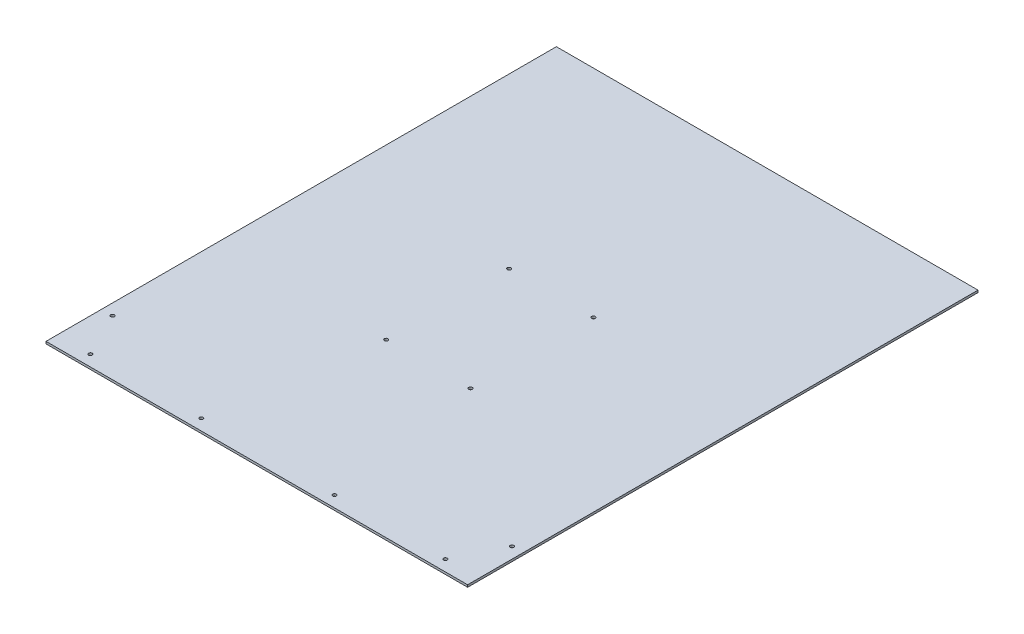
ISO-10303-21;
HEADER;
FILE_DESCRIPTION(('STEP AP214'),'2;1');
FILE_NAME('part.step','',(''),(''),'','','');
FILE_SCHEMA(('AUTOMOTIVE_DESIGN { 1 0 10303 214 1 1 1 1 }'));
ENDSEC;
DATA;
#1=APPLICATION_CONTEXT('core data for automotive mechanical design processes');
#2=APPLICATION_PROTOCOL_DEFINITION('international standard','automotive_design',2000,#1);
#3=PRODUCT_CONTEXT('',#1,'mechanical');
#4=PRODUCT('Part','Part','',(#3));
#5=PRODUCT_RELATED_PRODUCT_CATEGORY('part','',(#4));
#6=PRODUCT_DEFINITION_FORMATION('','',#4);
#7=PRODUCT_DEFINITION_CONTEXT('part definition',#1,'design');
#8=PRODUCT_DEFINITION('design','',#6,#7);
#9=PRODUCT_DEFINITION_SHAPE('','',#8);
#10=(LENGTH_UNIT() NAMED_UNIT(*) SI_UNIT(.MILLI.,.METRE.));
#11=(NAMED_UNIT(*) PLANE_ANGLE_UNIT() SI_UNIT($,.RADIAN.));
#12=(NAMED_UNIT(*) SI_UNIT($,.STERADIAN.) SOLID_ANGLE_UNIT());
#13=UNCERTAINTY_MEASURE_WITH_UNIT(LENGTH_MEASURE(1.E-05),#10,'distance_accuracy_value','');
#14=(GEOMETRIC_REPRESENTATION_CONTEXT(3) GLOBAL_UNCERTAINTY_ASSIGNED_CONTEXT((#13)) GLOBAL_UNIT_ASSIGNED_CONTEXT((#10,
#11,#12)) REPRESENTATION_CONTEXT('',''));
#15=CARTESIAN_POINT('',(0.,0.,0.));
#16=DIRECTION('',(0.,0.,1.));
#17=DIRECTION('',(1.,0.,0.));
#18=AXIS2_PLACEMENT_3D('',#15,#16,#17);
#19=CARTESIAN_POINT('',(475.,5.,0.));
#20=DIRECTION('',(1.,0.,0.));
#21=DIRECTION('',(0.,0.,-1.));
#22=AXIS2_PLACEMENT_3D('',#19,#20,#21);
#23=PLANE('',#22);
#24=DIRECTION('',(0.,0.,1.));
#25=VECTOR('',#24,1.);
#26=CARTESIAN_POINT('',(475.,0.,0.));
#27=LINE('',#26,#25);
#28=CARTESIAN_POINT('',(475.,0.,-575.));
#29=VERTEX_POINT('',#28);
#30=CARTESIAN_POINT('',(475.,0.,575.));
#31=VERTEX_POINT('',#30);
#32=EDGE_CURVE('E111',#29,#31,#27,.T.);
#33=ORIENTED_EDGE('',*,*,#32,.F.);
#34=DIRECTION('',(0.,-1.,0.));
#35=VECTOR('',#34,1.);
#36=CARTESIAN_POINT('',(475.,5.,-575.));
#37=LINE('',#36,#35);
#38=CARTESIAN_POINT('',(475.,5.,-575.));
#39=VERTEX_POINT('',#38);
#40=EDGE_CURVE('E11',#39,#29,#37,.T.);
#41=ORIENTED_EDGE('',*,*,#40,.F.);
#42=DIRECTION('',(0.,0.,1.));
#43=VECTOR('',#42,1.);
#44=CARTESIAN_POINT('',(475.,5.,0.));
#45=LINE('',#44,#43);
#46=CARTESIAN_POINT('',(475.,5.,575.));
#47=VERTEX_POINT('',#46);
#48=EDGE_CURVE('E101',#39,#47,#45,.T.);
#49=ORIENTED_EDGE('',*,*,#48,.T.);
#50=DIRECTION('',(0.,-1.,0.));
#51=VECTOR('',#50,1.);
#52=CARTESIAN_POINT('',(475.,5.,575.));
#53=LINE('',#52,#51);
#54=EDGE_CURVE('E80',#47,#31,#53,.T.);
#55=ORIENTED_EDGE('',*,*,#54,.T.);
#56=EDGE_LOOP('',(#33,#41,#49,#55));
#57=FACE_BOUND('',#56,.T.);
#58=ADVANCED_FACE('F41',(#57),#23,.T.);
#59=CARTESIAN_POINT('',(0.,5.,-575.));
#60=DIRECTION('',(0.,0.,-1.));
#61=DIRECTION('',(-1.,0.,0.));
#62=AXIS2_PLACEMENT_3D('',#59,#60,#61);
#63=PLANE('',#62);
#64=DIRECTION('',(1.,0.,0.));
#65=VECTOR('',#64,1.);
#66=CARTESIAN_POINT('',(0.,0.,-575.));
#67=LINE('',#66,#65);
#68=CARTESIAN_POINT('',(-475.,0.,-575.));
#69=VERTEX_POINT('',#68);
#70=EDGE_CURVE('E93',#69,#29,#67,.T.);
#71=ORIENTED_EDGE('',*,*,#70,.F.);
#72=DIRECTION('',(0.,-1.,0.));
#73=VECTOR('',#72,1.);
#74=CARTESIAN_POINT('',(-475.,5.,-575.));
#75=LINE('',#74,#73);
#76=CARTESIAN_POINT('',(-475.,5.,-575.));
#77=VERTEX_POINT('',#76);
#78=EDGE_CURVE('E50',#77,#69,#75,.T.);
#79=ORIENTED_EDGE('',*,*,#78,.F.);
#80=DIRECTION('',(1.,0.,0.));
#81=VECTOR('',#80,1.);
#82=CARTESIAN_POINT('',(0.,5.,-575.));
#83=LINE('',#82,#81);
#84=EDGE_CURVE('E91',#77,#39,#83,.T.);
#85=ORIENTED_EDGE('',*,*,#84,.T.);
#86=ORIENTED_EDGE('',*,*,#40,.T.);
#87=EDGE_LOOP('',(#71,#79,#85,#86));
#88=FACE_BOUND('',#87,.T.);
#89=ADVANCED_FACE('F89',(#88),#63,.T.);
#90=CARTESIAN_POINT('',(-475.,5.,0.));
#91=DIRECTION('',(1.,0.,0.));
#92=DIRECTION('',(0.,0.,-1.));
#93=AXIS2_PLACEMENT_3D('',#90,#91,#92);
#94=PLANE('',#93);
#95=DIRECTION('',(0.,0.,1.));
#96=VECTOR('',#95,1.);
#97=CARTESIAN_POINT('',(-475.,0.,0.));
#98=LINE('',#97,#96);
#99=CARTESIAN_POINT('',(-475.,0.,575.));
#100=VERTEX_POINT('',#99);
#101=EDGE_CURVE('E73',#69,#100,#98,.T.);
#102=ORIENTED_EDGE('',*,*,#101,.T.);
#103=DIRECTION('',(0.,-1.,0.));
#104=VECTOR('',#103,1.);
#105=CARTESIAN_POINT('',(-475.,5.,575.));
#106=LINE('',#105,#104);
#107=CARTESIAN_POINT('',(-475.,5.,575.));
#108=VERTEX_POINT('',#107);
#109=EDGE_CURVE('E95',#108,#100,#106,.T.);
#110=ORIENTED_EDGE('',*,*,#109,.F.);
#111=DIRECTION('',(0.,0.,1.));
#112=VECTOR('',#111,1.);
#113=CARTESIAN_POINT('',(-475.,5.,0.));
#114=LINE('',#113,#112);
#115=EDGE_CURVE('E96',#77,#108,#114,.T.);
#116=ORIENTED_EDGE('',*,*,#115,.F.);
#117=ORIENTED_EDGE('',*,*,#78,.T.);
#118=EDGE_LOOP('',(#102,#110,#116,#117));
#119=FACE_BOUND('',#118,.T.);
#120=ADVANCED_FACE('F97',(#119),#94,.F.);
#121=CARTESIAN_POINT('',(0.,5.,575.));
#122=DIRECTION('',(0.,0.,-1.));
#123=DIRECTION('',(-1.,0.,0.));
#124=AXIS2_PLACEMENT_3D('',#121,#122,#123);
#125=PLANE('',#124);
#126=DIRECTION('',(1.,0.,0.));
#127=VECTOR('',#126,1.);
#128=CARTESIAN_POINT('',(0.,0.,575.));
#129=LINE('',#128,#127);
#130=EDGE_CURVE('E105',#100,#31,#129,.T.);
#131=ORIENTED_EDGE('',*,*,#130,.T.);
#132=ORIENTED_EDGE('',*,*,#54,.F.);
#133=DIRECTION('',(1.,0.,0.));
#134=VECTOR('',#133,1.);
#135=CARTESIAN_POINT('',(0.,5.,575.));
#136=LINE('',#135,#134);
#137=EDGE_CURVE('E58',#108,#47,#136,.T.);
#138=ORIENTED_EDGE('',*,*,#137,.F.);
#139=ORIENTED_EDGE('',*,*,#109,.T.);
#140=EDGE_LOOP('',(#131,#132,#138,#139));
#141=FACE_BOUND('',#140,.T.);
#142=ADVANCED_FACE('F127',(#141),#125,.F.);
#143=CARTESIAN_POINT('',(0.,5.,0.));
#144=DIRECTION('',(0.,1.,0.));
#145=DIRECTION('',(0.,0.,1.));
#146=AXIS2_PLACEMENT_3D('',#143,#144,#145);
#147=PLANE('',#146);
#148=CARTESIAN_POINT('',(-450.,5.,450.));
#149=DIRECTION('',(0.,1.,0.));
#150=DIRECTION('',(0.,0.,1.));
#151=AXIS2_PLACEMENT_3D('',#148,#149,#150);
#152=CIRCLE('',#151,3.99999999999999);
#153=CARTESIAN_POINT('',(-450.,5.,454.));
#154=VERTEX_POINT('',#153);
#155=EDGE_CURVE('E191',#154,#154,#152,.T.);
#156=ORIENTED_EDGE('',*,*,#155,.F.);
#157=EDGE_LOOP('',(#156));
#158=FACE_BOUND('',#157,.T.);
#159=CARTESIAN_POINT('',(400.,5.,550.));
#160=DIRECTION('',(0.,1.,0.));
#161=DIRECTION('',(0.,0.,1.));
#162=AXIS2_PLACEMENT_3D('',#159,#160,#161);
#163=CIRCLE('',#162,3.99999999999994);
#164=CARTESIAN_POINT('',(400.,5.,554.));
#165=VERTEX_POINT('',#164);
#166=EDGE_CURVE('E234',#165,#165,#163,.T.);
#167=ORIENTED_EDGE('',*,*,#166,.F.);
#168=EDGE_LOOP('',(#167));
#169=FACE_BOUND('',#168,.T.);
#170=CARTESIAN_POINT('',(150.,5.,550.));
#171=DIRECTION('',(0.,1.,0.));
#172=DIRECTION('',(0.,0.,1.));
#173=AXIS2_PLACEMENT_3D('',#170,#171,#172);
#174=CIRCLE('',#173,3.99999999999999);
#175=CARTESIAN_POINT('',(150.,5.,554.));
#176=VERTEX_POINT('',#175);
#177=EDGE_CURVE('E230',#176,#176,#174,.T.);
#178=ORIENTED_EDGE('',*,*,#177,.F.);
#179=EDGE_LOOP('',(#178));
#180=FACE_BOUND('',#179,.T.);
#181=CARTESIAN_POINT('',(450.,5.,450.));
#182=DIRECTION('',(0.,1.,0.));
#183=DIRECTION('',(0.,0.,1.));
#184=AXIS2_PLACEMENT_3D('',#181,#182,#183);
#185=CIRCLE('',#184,3.99999999999999);
#186=CARTESIAN_POINT('',(450.,5.,454.));
#187=VERTEX_POINT('',#186);
#188=EDGE_CURVE('E226',#187,#187,#185,.T.);
#189=ORIENTED_EDGE('',*,*,#188,.F.);
#190=EDGE_LOOP('',(#189));
#191=FACE_BOUND('',#190,.T.);
#192=CARTESIAN_POINT('',(-150.,5.,550.));
#193=DIRECTION('',(0.,1.,0.));
#194=DIRECTION('',(0.,0.,1.));
#195=AXIS2_PLACEMENT_3D('',#192,#193,#194);
#196=CIRCLE('',#195,3.99999999999999);
#197=CARTESIAN_POINT('',(-150.,5.,554.));
#198=VERTEX_POINT('',#197);
#199=EDGE_CURVE('E202',#198,#198,#196,.T.);
#200=ORIENTED_EDGE('',*,*,#199,.F.);
#201=EDGE_LOOP('',(#200));
#202=FACE_BOUND('',#201,.T.);
#203=CARTESIAN_POINT('',(-400.,5.,550.));
#204=DIRECTION('',(0.,1.,0.));
#205=DIRECTION('',(0.,0.,1.));
#206=AXIS2_PLACEMENT_3D('',#203,#204,#205);
#207=CIRCLE('',#206,3.99999999999999);
#208=CARTESIAN_POINT('',(-400.,5.,554.));
#209=VERTEX_POINT('',#208);
#210=EDGE_CURVE('E196',#209,#209,#207,.T.);
#211=ORIENTED_EDGE('',*,*,#210,.F.);
#212=EDGE_LOOP('',(#211));
#213=FACE_BOUND('',#212,.T.);
#214=CARTESIAN_POINT('',(-94.9999999999999,5.,-88.5000000000001));
#215=DIRECTION('',(0.,1.,0.));
#216=DIRECTION('',(0.,0.,-1.));
#217=AXIS2_PLACEMENT_3D('',#214,#215,#216);
#218=CIRCLE('',#217,3.99999999999999);
#219=CARTESIAN_POINT('',(-94.9999999999999,5.,-92.5));
#220=VERTEX_POINT('',#219);
#221=EDGE_CURVE('E254',#220,#220,#218,.T.);
#222=ORIENTED_EDGE('',*,*,#221,.F.);
#223=EDGE_LOOP('',(#222));
#224=FACE_BOUND('',#223,.T.);
#225=CARTESIAN_POINT('',(95.0000000000001,5.,188.5));
#226=DIRECTION('',(0.,1.,0.));
#227=DIRECTION('',(0.,0.,-1.));
#228=AXIS2_PLACEMENT_3D('',#225,#226,#227);
#229=CIRCLE('',#228,3.99999999999999);
#230=CARTESIAN_POINT('',(95.0000000000001,5.,184.5));
#231=VERTEX_POINT('',#230);
#232=EDGE_CURVE('E245',#231,#231,#229,.T.);
#233=ORIENTED_EDGE('',*,*,#232,.F.);
#234=EDGE_LOOP('',(#233));
#235=FACE_BOUND('',#234,.T.);
#236=CARTESIAN_POINT('',(-94.9999999999999,5.,188.5));
#237=DIRECTION('',(0.,1.,0.));
#238=DIRECTION('',(0.,0.,1.));
#239=AXIS2_PLACEMENT_3D('',#236,#237,#238);
#240=CIRCLE('',#239,3.99999999999999);
#241=CARTESIAN_POINT('',(-94.9999999999999,5.,192.5));
#242=VERTEX_POINT('',#241);
#243=EDGE_CURVE('E240',#242,#242,#240,.T.);
#244=ORIENTED_EDGE('',*,*,#243,.F.);
#245=EDGE_LOOP('',(#244));
#246=FACE_BOUND('',#245,.T.);
#247=CARTESIAN_POINT('',(95.0000000000001,5.,-88.5000000000001));
#248=DIRECTION('',(0.,1.,0.));
#249=DIRECTION('',(0.,0.,1.));
#250=AXIS2_PLACEMENT_3D('',#247,#248,#249);
#251=CIRCLE('',#250,3.99999999999999);
#252=CARTESIAN_POINT('',(95.0000000000001,5.,-84.5000000000001));
#253=VERTEX_POINT('',#252);
#254=EDGE_CURVE('E253',#253,#253,#251,.T.);
#255=ORIENTED_EDGE('',*,*,#254,.F.);
#256=EDGE_LOOP('',(#255));
#257=FACE_BOUND('',#256,.T.);
#258=ORIENTED_EDGE('',*,*,#48,.F.);
#259=ORIENTED_EDGE('',*,*,#84,.F.);
#260=ORIENTED_EDGE('',*,*,#115,.T.);
#261=ORIENTED_EDGE('',*,*,#137,.T.);
#262=EDGE_LOOP('',(#258,#259,#260,#261));
#263=FACE_BOUND('',#262,.T.);
#264=ADVANCED_FACE('F100',(#158,#169,#180,#191,#202,#213,#224,#235,#246,#257,#263),#147,.T.);
#265=CARTESIAN_POINT('',(0.,0.,0.));
#266=DIRECTION('',(0.,1.,0.));
#267=DIRECTION('',(0.,0.,1.));
#268=AXIS2_PLACEMENT_3D('',#265,#266,#267);
#269=PLANE('',#268);
#270=CARTESIAN_POINT('',(-450.,0.,450.));
#271=DIRECTION('',(0.,-1.,0.));
#272=DIRECTION('',(0.,0.,-1.));
#273=AXIS2_PLACEMENT_3D('',#270,#271,#272);
#274=CIRCLE('',#273,3.99999999999999);
#275=CARTESIAN_POINT('',(-450.,0.,446.));
#276=VERTEX_POINT('',#275);
#277=EDGE_CURVE('E194',#276,#276,#274,.T.);
#278=ORIENTED_EDGE('',*,*,#277,.F.);
#279=EDGE_LOOP('',(#278));
#280=FACE_BOUND('',#279,.T.);
#281=CARTESIAN_POINT('',(400.,0.,550.));
#282=DIRECTION('',(0.,-1.,0.));
#283=DIRECTION('',(0.,0.,1.));
#284=AXIS2_PLACEMENT_3D('',#281,#282,#283);
#285=CIRCLE('',#284,3.99999999999994);
#286=CARTESIAN_POINT('',(400.,0.,554.));
#287=VERTEX_POINT('',#286);
#288=EDGE_CURVE('E208',#287,#287,#285,.T.);
#289=ORIENTED_EDGE('',*,*,#288,.F.);
#290=EDGE_LOOP('',(#289));
#291=FACE_BOUND('',#290,.T.);
#292=CARTESIAN_POINT('',(150.,0.,550.));
#293=DIRECTION('',(0.,-1.,0.));
#294=DIRECTION('',(0.,0.,1.));
#295=AXIS2_PLACEMENT_3D('',#292,#293,#294);
#296=CIRCLE('',#295,3.99999999999999);
#297=CARTESIAN_POINT('',(150.,0.,554.));
#298=VERTEX_POINT('',#297);
#299=EDGE_CURVE('E211',#298,#298,#296,.T.);
#300=ORIENTED_EDGE('',*,*,#299,.F.);
#301=EDGE_LOOP('',(#300));
#302=FACE_BOUND('',#301,.T.);
#303=CARTESIAN_POINT('',(450.,0.,450.));
#304=DIRECTION('',(0.,-1.,0.));
#305=DIRECTION('',(0.,0.,1.));
#306=AXIS2_PLACEMENT_3D('',#303,#304,#305);
#307=CIRCLE('',#306,3.99999999999999);
#308=CARTESIAN_POINT('',(450.,0.,454.));
#309=VERTEX_POINT('',#308);
#310=EDGE_CURVE('E216',#309,#309,#307,.T.);
#311=ORIENTED_EDGE('',*,*,#310,.F.);
#312=EDGE_LOOP('',(#311));
#313=FACE_BOUND('',#312,.T.);
#314=CARTESIAN_POINT('',(-150.,0.,550.));
#315=DIRECTION('',(0.,-1.,0.));
#316=DIRECTION('',(0.,0.,-1.));
#317=AXIS2_PLACEMENT_3D('',#314,#315,#316);
#318=CIRCLE('',#317,3.99999999999999);
#319=CARTESIAN_POINT('',(-150.,0.,546.));
#320=VERTEX_POINT('',#319);
#321=EDGE_CURVE('E205',#320,#320,#318,.T.);
#322=ORIENTED_EDGE('',*,*,#321,.F.);
#323=EDGE_LOOP('',(#322));
#324=FACE_BOUND('',#323,.T.);
#325=CARTESIAN_POINT('',(-400.,0.,550.));
#326=DIRECTION('',(0.,-1.,0.));
#327=DIRECTION('',(0.,0.,-1.));
#328=AXIS2_PLACEMENT_3D('',#325,#326,#327);
#329=CIRCLE('',#328,3.99999999999999);
#330=CARTESIAN_POINT('',(-400.,0.,546.));
#331=VERTEX_POINT('',#330);
#332=EDGE_CURVE('E197',#331,#331,#329,.T.);
#333=ORIENTED_EDGE('',*,*,#332,.F.);
#334=EDGE_LOOP('',(#333));
#335=FACE_BOUND('',#334,.T.);
#336=CARTESIAN_POINT('',(-94.9999999999999,0.,-88.5000000000001));
#337=DIRECTION('',(0.,1.,0.));
#338=DIRECTION('',(0.,0.,-1.));
#339=AXIS2_PLACEMENT_3D('',#336,#337,#338);
#340=CIRCLE('',#339,3.99999999999999);
#341=CARTESIAN_POINT('',(-94.9999999999999,0.,-92.5));
#342=VERTEX_POINT('',#341);
#343=EDGE_CURVE('E249',#342,#342,#340,.T.);
#344=ORIENTED_EDGE('',*,*,#343,.T.);
#345=EDGE_LOOP('',(#344));
#346=FACE_BOUND('',#345,.T.);
#347=CARTESIAN_POINT('',(95.0000000000001,0.,188.5));
#348=DIRECTION('',(0.,1.,0.));
#349=DIRECTION('',(0.,0.,-1.));
#350=AXIS2_PLACEMENT_3D('',#347,#348,#349);
#351=CIRCLE('',#350,3.99999999999999);
#352=CARTESIAN_POINT('',(95.0000000000001,0.,184.5));
#353=VERTEX_POINT('',#352);
#354=EDGE_CURVE('E258',#353,#353,#351,.T.);
#355=ORIENTED_EDGE('',*,*,#354,.T.);
#356=EDGE_LOOP('',(#355));
#357=FACE_BOUND('',#356,.T.);
#358=CARTESIAN_POINT('',(-94.9999999999999,0.,188.5));
#359=DIRECTION('',(0.,1.,0.));
#360=DIRECTION('',(0.,0.,1.));
#361=AXIS2_PLACEMENT_3D('',#358,#359,#360);
#362=CIRCLE('',#361,3.99999999999999);
#363=CARTESIAN_POINT('',(-94.9999999999999,0.,192.5));
#364=VERTEX_POINT('',#363);
#365=EDGE_CURVE('E241',#364,#364,#362,.T.);
#366=ORIENTED_EDGE('',*,*,#365,.T.);
#367=EDGE_LOOP('',(#366));
#368=FACE_BOUND('',#367,.T.);
#369=CARTESIAN_POINT('',(95.0000000000001,0.,-88.5000000000001));
#370=DIRECTION('',(0.,1.,0.));
#371=DIRECTION('',(0.,0.,1.));
#372=AXIS2_PLACEMENT_3D('',#369,#370,#371);
#373=CIRCLE('',#372,3.99999999999999);
#374=CARTESIAN_POINT('',(95.0000000000001,0.,-84.5000000000001));
#375=VERTEX_POINT('',#374);
#376=EDGE_CURVE('E115',#375,#375,#373,.T.);
#377=ORIENTED_EDGE('',*,*,#376,.T.);
#378=EDGE_LOOP('',(#377));
#379=FACE_BOUND('',#378,.T.);
#380=ORIENTED_EDGE('',*,*,#32,.T.);
#381=ORIENTED_EDGE('',*,*,#130,.F.);
#382=ORIENTED_EDGE('',*,*,#101,.F.);
#383=ORIENTED_EDGE('',*,*,#70,.T.);
#384=EDGE_LOOP('',(#380,#381,#382,#383));
#385=FACE_BOUND('',#384,.T.);
#386=ADVANCED_FACE('F129',(#280,#291,#302,#313,#324,#335,#346,#357,#368,#379,#385),#269,.F.);
#387=CARTESIAN_POINT('',(95.0000000000001,0.,-88.5000000000001));
#388=DIRECTION('',(0.,1.,0.));
#389=DIRECTION('',(0.,0.,1.));
#390=AXIS2_PLACEMENT_3D('',#387,#388,#389);
#391=CYLINDRICAL_SURFACE('',#390,3.99999999999999);
#392=ORIENTED_EDGE('',*,*,#376,.F.);
#393=EDGE_LOOP('',(#392));
#394=FACE_BOUND('',#393,.T.);
#395=ORIENTED_EDGE('',*,*,#254,.T.);
#396=EDGE_LOOP('',(#395));
#397=FACE_BOUND('',#396,.T.);
#398=ADVANCED_FACE('F143',(#394,#397),#391,.F.);
#399=CARTESIAN_POINT('',(-94.9999999999999,0.,188.5));
#400=DIRECTION('',(0.,1.,0.));
#401=DIRECTION('',(0.,0.,1.));
#402=AXIS2_PLACEMENT_3D('',#399,#400,#401);
#403=CYLINDRICAL_SURFACE('',#402,3.99999999999999);
#404=ORIENTED_EDGE('',*,*,#365,.F.);
#405=EDGE_LOOP('',(#404));
#406=FACE_BOUND('',#405,.T.);
#407=ORIENTED_EDGE('',*,*,#243,.T.);
#408=EDGE_LOOP('',(#407));
#409=FACE_BOUND('',#408,.T.);
#410=ADVANCED_FACE('F150',(#406,#409),#403,.F.);
#411=CARTESIAN_POINT('',(95.0000000000001,0.,188.5));
#412=DIRECTION('',(0.,1.,0.));
#413=DIRECTION('',(0.,0.,1.));
#414=AXIS2_PLACEMENT_3D('',#411,#412,#413);
#415=CYLINDRICAL_SURFACE('',#414,3.99999999999999);
#416=ORIENTED_EDGE('',*,*,#354,.F.);
#417=EDGE_LOOP('',(#416));
#418=FACE_BOUND('',#417,.T.);
#419=ORIENTED_EDGE('',*,*,#232,.T.);
#420=EDGE_LOOP('',(#419));
#421=FACE_BOUND('',#420,.T.);
#422=ADVANCED_FACE('F152',(#418,#421),#415,.F.);
#423=CARTESIAN_POINT('',(-94.9999999999999,0.,-88.5000000000001));
#424=DIRECTION('',(0.,1.,0.));
#425=DIRECTION('',(0.,0.,1.));
#426=AXIS2_PLACEMENT_3D('',#423,#424,#425);
#427=CYLINDRICAL_SURFACE('',#426,3.99999999999999);
#428=ORIENTED_EDGE('',*,*,#343,.F.);
#429=EDGE_LOOP('',(#428));
#430=FACE_BOUND('',#429,.T.);
#431=ORIENTED_EDGE('',*,*,#221,.T.);
#432=EDGE_LOOP('',(#431));
#433=FACE_BOUND('',#432,.T.);
#434=ADVANCED_FACE('F155',(#430,#433),#427,.F.);
#435=CARTESIAN_POINT('',(-400.,10.,550.));
#436=DIRECTION('',(0.,-1.,0.));
#437=DIRECTION('',(0.,0.,-1.));
#438=AXIS2_PLACEMENT_3D('',#435,#436,#437);
#439=CYLINDRICAL_SURFACE('',#438,3.99999999999999);
#440=ORIENTED_EDGE('',*,*,#210,.T.);
#441=EDGE_LOOP('',(#440));
#442=FACE_BOUND('',#441,.T.);
#443=ORIENTED_EDGE('',*,*,#332,.T.);
#444=EDGE_LOOP('',(#443));
#445=FACE_BOUND('',#444,.T.);
#446=ADVANCED_FACE('F159',(#442,#445),#439,.F.);
#447=CARTESIAN_POINT('',(-150.,10.,550.));
#448=DIRECTION('',(0.,-1.,0.));
#449=DIRECTION('',(0.,0.,-1.));
#450=AXIS2_PLACEMENT_3D('',#447,#448,#449);
#451=CYLINDRICAL_SURFACE('',#450,3.99999999999999);
#452=ORIENTED_EDGE('',*,*,#199,.T.);
#453=EDGE_LOOP('',(#452));
#454=FACE_BOUND('',#453,.T.);
#455=ORIENTED_EDGE('',*,*,#321,.T.);
#456=EDGE_LOOP('',(#455));
#457=FACE_BOUND('',#456,.T.);
#458=ADVANCED_FACE('F172',(#454,#457),#451,.F.);
#459=CARTESIAN_POINT('',(450.,10.,450.));
#460=DIRECTION('',(0.,-1.,0.));
#461=DIRECTION('',(0.,0.,-1.));
#462=AXIS2_PLACEMENT_3D('',#459,#460,#461);
#463=CYLINDRICAL_SURFACE('',#462,3.99999999999999);
#464=ORIENTED_EDGE('',*,*,#188,.T.);
#465=EDGE_LOOP('',(#464));
#466=FACE_BOUND('',#465,.T.);
#467=ORIENTED_EDGE('',*,*,#310,.T.);
#468=EDGE_LOOP('',(#467));
#469=FACE_BOUND('',#468,.T.);
#470=ADVANCED_FACE('F168',(#466,#469),#463,.F.);
#471=CARTESIAN_POINT('',(150.,10.,550.));
#472=DIRECTION('',(0.,-1.,0.));
#473=DIRECTION('',(0.,0.,-1.));
#474=AXIS2_PLACEMENT_3D('',#471,#472,#473);
#475=CYLINDRICAL_SURFACE('',#474,3.99999999999999);
#476=ORIENTED_EDGE('',*,*,#177,.T.);
#477=EDGE_LOOP('',(#476));
#478=FACE_BOUND('',#477,.T.);
#479=ORIENTED_EDGE('',*,*,#299,.T.);
#480=EDGE_LOOP('',(#479));
#481=FACE_BOUND('',#480,.T.);
#482=ADVANCED_FACE('F164',(#478,#481),#475,.F.);
#483=CARTESIAN_POINT('',(400.,10.,550.));
#484=DIRECTION('',(0.,-1.,0.));
#485=DIRECTION('',(0.,0.,-1.));
#486=AXIS2_PLACEMENT_3D('',#483,#484,#485);
#487=CYLINDRICAL_SURFACE('',#486,3.99999999999994);
#488=ORIENTED_EDGE('',*,*,#166,.T.);
#489=EDGE_LOOP('',(#488));
#490=FACE_BOUND('',#489,.T.);
#491=ORIENTED_EDGE('',*,*,#288,.T.);
#492=EDGE_LOOP('',(#491));
#493=FACE_BOUND('',#492,.T.);
#494=ADVANCED_FACE('F167',(#490,#493),#487,.F.);
#495=CARTESIAN_POINT('',(-450.,10.,450.));
#496=DIRECTION('',(0.,-1.,0.));
#497=DIRECTION('',(0.,0.,-1.));
#498=AXIS2_PLACEMENT_3D('',#495,#496,#497);
#499=CYLINDRICAL_SURFACE('',#498,3.99999999999999);
#500=ORIENTED_EDGE('',*,*,#155,.T.);
#501=EDGE_LOOP('',(#500));
#502=FACE_BOUND('',#501,.T.);
#503=ORIENTED_EDGE('',*,*,#277,.T.);
#504=EDGE_LOOP('',(#503));
#505=FACE_BOUND('',#504,.T.);
#506=ADVANCED_FACE('F182',(#502,#505),#499,.F.);
#507=CLOSED_SHELL('',(#58,#89,#120,#142,#264,#386,#398,#410,#422,#434,#446,#458,#470,#482,#494,#506));
#508=MANIFOLD_SOLID_BREP('B2',#507);
#509=ADVANCED_BREP_SHAPE_REPRESENTATION('',(#18,#508),#14);
#510=SHAPE_DEFINITION_REPRESENTATION(#9,#509);
ENDSEC;
END-ISO-10303-21;
